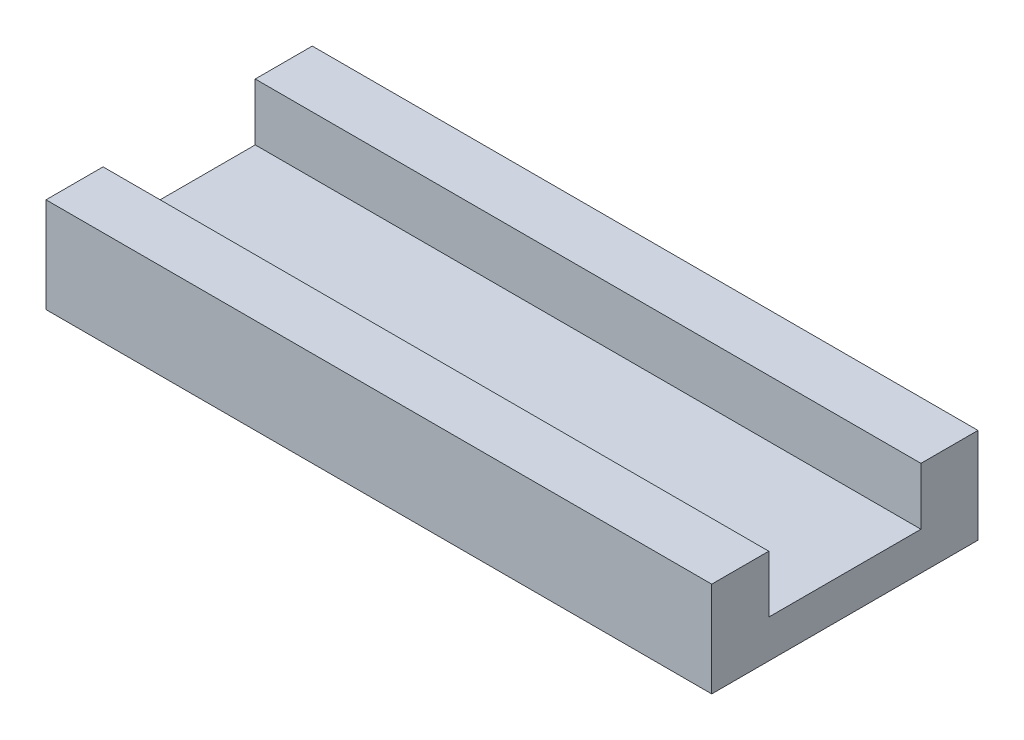
ISO-10303-21;
HEADER;
FILE_DESCRIPTION(('STEP AP214'),'2;1');
FILE_NAME('part.step','',(''),(''),'','','');
FILE_SCHEMA(('AUTOMOTIVE_DESIGN { 1 0 10303 214 1 1 1 1 }'));
ENDSEC;
DATA;
#1=APPLICATION_CONTEXT('core data for automotive mechanical design processes');
#2=APPLICATION_PROTOCOL_DEFINITION('international standard','automotive_design',2000,#1);
#3=PRODUCT_CONTEXT('',#1,'mechanical');
#4=PRODUCT('Part','Part','',(#3));
#5=PRODUCT_RELATED_PRODUCT_CATEGORY('part','',(#4));
#6=PRODUCT_DEFINITION_FORMATION('','',#4);
#7=PRODUCT_DEFINITION_CONTEXT('part definition',#1,'design');
#8=PRODUCT_DEFINITION('design','',#6,#7);
#9=PRODUCT_DEFINITION_SHAPE('','',#8);
#10=(LENGTH_UNIT() NAMED_UNIT(*) SI_UNIT(.MILLI.,.METRE.));
#11=(NAMED_UNIT(*) PLANE_ANGLE_UNIT() SI_UNIT($,.RADIAN.));
#12=(NAMED_UNIT(*) SI_UNIT($,.STERADIAN.) SOLID_ANGLE_UNIT());
#13=UNCERTAINTY_MEASURE_WITH_UNIT(LENGTH_MEASURE(1.E-05),#10,'distance_accuracy_value','');
#14=(GEOMETRIC_REPRESENTATION_CONTEXT(3) GLOBAL_UNCERTAINTY_ASSIGNED_CONTEXT((#13)) GLOBAL_UNIT_ASSIGNED_CONTEXT((#10,
#11,#12)) REPRESENTATION_CONTEXT('',''));
#15=CARTESIAN_POINT('',(0.,0.,0.));
#16=DIRECTION('',(0.,0.,1.));
#17=DIRECTION('',(1.,0.,0.));
#18=AXIS2_PLACEMENT_3D('',#15,#16,#17);
#19=CARTESIAN_POINT('',(-35.,-1.,-7.));
#20=DIRECTION('',(0.,0.,-1.));
#21=DIRECTION('',(-1.,0.,0.));
#22=AXIS2_PLACEMENT_3D('',#19,#20,#21);
#23=PLANE('',#22);
#24=DIRECTION('',(0.,1.,0.));
#25=VECTOR('',#24,1.);
#26=CARTESIAN_POINT('',(0.,-1.,-7.));
#27=LINE('',#26,#25);
#28=CARTESIAN_POINT('',(0.,-1.,-7.));
#29=VERTEX_POINT('',#28);
#30=CARTESIAN_POINT('',(0.,4.,-7.));
#31=VERTEX_POINT('',#30);
#32=EDGE_CURVE('E153',#29,#31,#27,.T.);
#33=ORIENTED_EDGE('',*,*,#32,.F.);
#34=DIRECTION('',(1.,0.,0.));
#35=VECTOR('',#34,1.);
#36=CARTESIAN_POINT('',(-35.,-1.,-7.));
#37=LINE('',#36,#35);
#38=CARTESIAN_POINT('',(-35.,-1.,-7.));
#39=VERTEX_POINT('',#38);
#40=EDGE_CURVE('E11',#39,#29,#37,.T.);
#41=ORIENTED_EDGE('',*,*,#40,.F.);
#42=DIRECTION('',(0.,1.,0.));
#43=VECTOR('',#42,1.);
#44=CARTESIAN_POINT('',(-35.,1.,-7.));
#45=LINE('',#44,#43);
#46=CARTESIAN_POINT('',(-35.,4.,-7.));
#47=VERTEX_POINT('',#46);
#48=EDGE_CURVE('E56',#39,#47,#45,.T.);
#49=ORIENTED_EDGE('',*,*,#48,.T.);
#50=DIRECTION('',(1.,0.,0.));
#51=VECTOR('',#50,1.);
#52=CARTESIAN_POINT('',(-35.,4.,-7.));
#53=LINE('',#52,#51);
#54=EDGE_CURVE('E41',#47,#31,#53,.T.);
#55=ORIENTED_EDGE('',*,*,#54,.T.);
#56=EDGE_LOOP('',(#33,#41,#49,#55));
#57=FACE_BOUND('',#56,.T.);
#58=ADVANCED_FACE('F37',(#57),#23,.T.);
#59=CARTESIAN_POINT('',(-35.,-1.,7.));
#60=DIRECTION('',(0.,-1.,0.));
#61=DIRECTION('',(0.,0.,-1.));
#62=AXIS2_PLACEMENT_3D('',#59,#60,#61);
#63=PLANE('',#62);
#64=DIRECTION('',(0.,0.,-1.));
#65=VECTOR('',#64,1.);
#66=CARTESIAN_POINT('',(0.,-1.,7.));
#67=LINE('',#66,#65);
#68=CARTESIAN_POINT('',(0.,-1.,7.));
#69=VERTEX_POINT('',#68);
#70=EDGE_CURVE('E151',#69,#29,#67,.T.);
#71=ORIENTED_EDGE('',*,*,#70,.F.);
#72=DIRECTION('',(1.,0.,0.));
#73=VECTOR('',#72,1.);
#74=CARTESIAN_POINT('',(-35.,-1.,7.));
#75=LINE('',#74,#73);
#76=CARTESIAN_POINT('',(-35.,-1.,7.));
#77=VERTEX_POINT('',#76);
#78=EDGE_CURVE('E47',#77,#69,#75,.T.);
#79=ORIENTED_EDGE('',*,*,#78,.F.);
#80=DIRECTION('',(0.,0.,-1.));
#81=VECTOR('',#80,1.);
#82=CARTESIAN_POINT('',(-35.,-1.,7.));
#83=LINE('',#82,#81);
#84=EDGE_CURVE('E126',#77,#39,#83,.T.);
#85=ORIENTED_EDGE('',*,*,#84,.T.);
#86=ORIENTED_EDGE('',*,*,#40,.T.);
#87=EDGE_LOOP('',(#71,#79,#85,#86));
#88=FACE_BOUND('',#87,.T.);
#89=ADVANCED_FACE('F166',(#88),#63,.T.);
#90=CARTESIAN_POINT('',(-35.,-1.,7.));
#91=DIRECTION('',(0.,0.,1.));
#92=DIRECTION('',(1.,0.,0.));
#93=AXIS2_PLACEMENT_3D('',#90,#91,#92);
#94=PLANE('',#93);
#95=DIRECTION('',(0.,-1.,0.));
#96=VECTOR('',#95,1.);
#97=CARTESIAN_POINT('',(0.,-1.,7.));
#98=LINE('',#97,#96);
#99=CARTESIAN_POINT('',(0.,4.,7.));
#100=VERTEX_POINT('',#99);
#101=EDGE_CURVE('E114',#100,#69,#98,.T.);
#102=ORIENTED_EDGE('',*,*,#101,.F.);
#103=DIRECTION('',(1.,0.,0.));
#104=VECTOR('',#103,1.);
#105=CARTESIAN_POINT('',(-35.,4.,7.));
#106=LINE('',#105,#104);
#107=CARTESIAN_POINT('',(-35.,4.,7.));
#108=VERTEX_POINT('',#107);
#109=EDGE_CURVE('E109',#108,#100,#106,.T.);
#110=ORIENTED_EDGE('',*,*,#109,.F.);
#111=DIRECTION('',(0.,-1.,0.));
#112=VECTOR('',#111,1.);
#113=CARTESIAN_POINT('',(-35.,1.,7.));
#114=LINE('',#113,#112);
#115=EDGE_CURVE('E112',#108,#77,#114,.T.);
#116=ORIENTED_EDGE('',*,*,#115,.T.);
#117=ORIENTED_EDGE('',*,*,#78,.T.);
#118=EDGE_LOOP('',(#102,#110,#116,#117));
#119=FACE_BOUND('',#118,.T.);
#120=ADVANCED_FACE('F111',(#119),#94,.T.);
#121=CARTESIAN_POINT('',(-35.,4.,7.));
#122=DIRECTION('',(0.,1.,0.));
#123=DIRECTION('',(0.,0.,1.));
#124=AXIS2_PLACEMENT_3D('',#121,#122,#123);
#125=PLANE('',#124);
#126=DIRECTION('',(0.,0.,1.));
#127=VECTOR('',#126,1.);
#128=CARTESIAN_POINT('',(0.,4.,7.));
#129=LINE('',#128,#127);
#130=CARTESIAN_POINT('',(0.,4.,4.));
#131=VERTEX_POINT('',#130);
#132=EDGE_CURVE('E148',#131,#100,#129,.T.);
#133=ORIENTED_EDGE('',*,*,#132,.F.);
#134=DIRECTION('',(1.,0.,0.));
#135=VECTOR('',#134,1.);
#136=CARTESIAN_POINT('',(-35.,4.,4.));
#137=LINE('',#136,#135);
#138=CARTESIAN_POINT('',(-35.,4.,4.));
#139=VERTEX_POINT('',#138);
#140=EDGE_CURVE('E119',#139,#131,#137,.T.);
#141=ORIENTED_EDGE('',*,*,#140,.F.);
#142=DIRECTION('',(0.,0.,1.));
#143=VECTOR('',#142,1.);
#144=CARTESIAN_POINT('',(-35.,4.,7.));
#145=LINE('',#144,#143);
#146=EDGE_CURVE('E124',#139,#108,#145,.T.);
#147=ORIENTED_EDGE('',*,*,#146,.T.);
#148=ORIENTED_EDGE('',*,*,#109,.T.);
#149=EDGE_LOOP('',(#133,#141,#147,#148));
#150=FACE_BOUND('',#149,.T.);
#151=ADVANCED_FACE('F128',(#150),#125,.T.);
#152=CARTESIAN_POINT('',(-35.,4.,4.));
#153=DIRECTION('',(0.,0.,-1.));
#154=DIRECTION('',(-1.,0.,0.));
#155=AXIS2_PLACEMENT_3D('',#152,#153,#154);
#156=PLANE('',#155);
#157=DIRECTION('',(0.,1.,0.));
#158=VECTOR('',#157,1.);
#159=CARTESIAN_POINT('',(0.,4.,4.));
#160=LINE('',#159,#158);
#161=CARTESIAN_POINT('',(0.,1.,4.));
#162=VERTEX_POINT('',#161);
#163=EDGE_CURVE('E145',#162,#131,#160,.T.);
#164=ORIENTED_EDGE('',*,*,#163,.F.);
#165=DIRECTION('',(1.,0.,0.));
#166=VECTOR('',#165,1.);
#167=CARTESIAN_POINT('',(-35.,1.,4.));
#168=LINE('',#167,#166);
#169=CARTESIAN_POINT('',(-35.,1.,4.));
#170=VERTEX_POINT('',#169);
#171=EDGE_CURVE('E157',#170,#162,#168,.T.);
#172=ORIENTED_EDGE('',*,*,#171,.F.);
#173=DIRECTION('',(0.,1.,0.));
#174=VECTOR('',#173,1.);
#175=CARTESIAN_POINT('',(-35.,4.,4.));
#176=LINE('',#175,#174);
#177=EDGE_CURVE('E129',#170,#139,#176,.T.);
#178=ORIENTED_EDGE('',*,*,#177,.T.);
#179=ORIENTED_EDGE('',*,*,#140,.T.);
#180=EDGE_LOOP('',(#164,#172,#178,#179));
#181=FACE_BOUND('',#180,.T.);
#182=ADVANCED_FACE('F179',(#181),#156,.T.);
#183=CARTESIAN_POINT('',(-35.,1.,4.));
#184=DIRECTION('',(0.,1.,0.));
#185=DIRECTION('',(0.,0.,1.));
#186=AXIS2_PLACEMENT_3D('',#183,#184,#185);
#187=PLANE('',#186);
#188=DIRECTION('',(0.,0.,1.));
#189=VECTOR('',#188,1.);
#190=CARTESIAN_POINT('',(0.,1.,4.));
#191=LINE('',#190,#189);
#192=CARTESIAN_POINT('',(0.,1.,-4.));
#193=VERTEX_POINT('',#192);
#194=EDGE_CURVE('E142',#193,#162,#191,.T.);
#195=ORIENTED_EDGE('',*,*,#194,.F.);
#196=DIRECTION('',(1.,0.,0.));
#197=VECTOR('',#196,1.);
#198=CARTESIAN_POINT('',(-35.,1.,-4.));
#199=LINE('',#198,#197);
#200=CARTESIAN_POINT('',(-35.,1.,-4.));
#201=VERTEX_POINT('',#200);
#202=EDGE_CURVE('E159',#201,#193,#199,.T.);
#203=ORIENTED_EDGE('',*,*,#202,.F.);
#204=DIRECTION('',(0.,0.,1.));
#205=VECTOR('',#204,1.);
#206=CARTESIAN_POINT('',(-35.,1.,4.));
#207=LINE('',#206,#205);
#208=EDGE_CURVE('E131',#201,#170,#207,.T.);
#209=ORIENTED_EDGE('',*,*,#208,.T.);
#210=ORIENTED_EDGE('',*,*,#171,.T.);
#211=EDGE_LOOP('',(#195,#203,#209,#210));
#212=FACE_BOUND('',#211,.T.);
#213=ADVANCED_FACE('F182',(#212),#187,.T.);
#214=CARTESIAN_POINT('',(-35.,4.,-4.));
#215=DIRECTION('',(0.,0.,1.));
#216=DIRECTION('',(1.,0.,0.));
#217=AXIS2_PLACEMENT_3D('',#214,#215,#216);
#218=PLANE('',#217);
#219=DIRECTION('',(0.,-1.,0.));
#220=VECTOR('',#219,1.);
#221=CARTESIAN_POINT('',(0.,4.,-4.));
#222=LINE('',#221,#220);
#223=CARTESIAN_POINT('',(0.,4.,-4.));
#224=VERTEX_POINT('',#223);
#225=EDGE_CURVE('E139',#224,#193,#222,.T.);
#226=ORIENTED_EDGE('',*,*,#225,.F.);
#227=DIRECTION('',(1.,0.,0.));
#228=VECTOR('',#227,1.);
#229=CARTESIAN_POINT('',(-35.,4.,-4.));
#230=LINE('',#229,#228);
#231=CARTESIAN_POINT('',(-35.,4.,-4.));
#232=VERTEX_POINT('',#231);
#233=EDGE_CURVE('E160',#232,#224,#230,.T.);
#234=ORIENTED_EDGE('',*,*,#233,.F.);
#235=DIRECTION('',(0.,-1.,0.));
#236=VECTOR('',#235,1.);
#237=CARTESIAN_POINT('',(-35.,4.,-4.));
#238=LINE('',#237,#236);
#239=EDGE_CURVE('E195',#232,#201,#238,.T.);
#240=ORIENTED_EDGE('',*,*,#239,.T.);
#241=ORIENTED_EDGE('',*,*,#202,.T.);
#242=EDGE_LOOP('',(#226,#234,#240,#241));
#243=FACE_BOUND('',#242,.T.);
#244=ADVANCED_FACE('F185',(#243),#218,.T.);
#245=CARTESIAN_POINT('',(-35.,4.,-7.));
#246=DIRECTION('',(0.,1.,0.));
#247=DIRECTION('',(0.,0.,1.));
#248=AXIS2_PLACEMENT_3D('',#245,#246,#247);
#249=PLANE('',#248);
#250=DIRECTION('',(0.,0.,1.));
#251=VECTOR('',#250,1.);
#252=CARTESIAN_POINT('',(0.,4.,-7.));
#253=LINE('',#252,#251);
#254=EDGE_CURVE('E136',#31,#224,#253,.T.);
#255=ORIENTED_EDGE('',*,*,#254,.F.);
#256=ORIENTED_EDGE('',*,*,#54,.F.);
#257=DIRECTION('',(0.,0.,1.));
#258=VECTOR('',#257,1.);
#259=CARTESIAN_POINT('',(-35.,4.,-7.));
#260=LINE('',#259,#258);
#261=EDGE_CURVE('E199',#47,#232,#260,.T.);
#262=ORIENTED_EDGE('',*,*,#261,.T.);
#263=ORIENTED_EDGE('',*,*,#233,.T.);
#264=EDGE_LOOP('',(#255,#256,#262,#263));
#265=FACE_BOUND('',#264,.T.);
#266=ADVANCED_FACE('F39',(#265),#249,.T.);
#267=CARTESIAN_POINT('',(-35.,0.,0.));
#268=DIRECTION('',(1.,0.,0.));
#269=DIRECTION('',(0.,0.,-1.));
#270=AXIS2_PLACEMENT_3D('',#267,#268,#269);
#271=PLANE('',#270);
#272=ORIENTED_EDGE('',*,*,#48,.F.);
#273=ORIENTED_EDGE('',*,*,#84,.F.);
#274=ORIENTED_EDGE('',*,*,#115,.F.);
#275=ORIENTED_EDGE('',*,*,#146,.F.);
#276=ORIENTED_EDGE('',*,*,#177,.F.);
#277=ORIENTED_EDGE('',*,*,#208,.F.);
#278=ORIENTED_EDGE('',*,*,#239,.F.);
#279=ORIENTED_EDGE('',*,*,#261,.F.);
#280=EDGE_LOOP('',(#272,#273,#274,#275,#276,#277,#278,#279));
#281=FACE_BOUND('',#280,.T.);
#282=ADVANCED_FACE('F122',(#281),#271,.F.);
#283=CARTESIAN_POINT('',(0.,0.,0.));
#284=DIRECTION('',(1.,0.,0.));
#285=DIRECTION('',(0.,0.,-1.));
#286=AXIS2_PLACEMENT_3D('',#283,#284,#285);
#287=PLANE('',#286);
#288=ORIENTED_EDGE('',*,*,#32,.T.);
#289=ORIENTED_EDGE('',*,*,#254,.T.);
#290=ORIENTED_EDGE('',*,*,#225,.T.);
#291=ORIENTED_EDGE('',*,*,#194,.T.);
#292=ORIENTED_EDGE('',*,*,#163,.T.);
#293=ORIENTED_EDGE('',*,*,#132,.T.);
#294=ORIENTED_EDGE('',*,*,#101,.T.);
#295=ORIENTED_EDGE('',*,*,#70,.T.);
#296=EDGE_LOOP('',(#288,#289,#290,#291,#292,#293,#294,#295));
#297=FACE_BOUND('',#296,.T.);
#298=ADVANCED_FACE('F165',(#297),#287,.T.);
#299=CLOSED_SHELL('',(#58,#89,#120,#151,#182,#213,#244,#266,#282,#298));
#300=MANIFOLD_SOLID_BREP('B2',#299);
#301=ADVANCED_BREP_SHAPE_REPRESENTATION('',(#18,#300),#14);
#302=SHAPE_DEFINITION_REPRESENTATION(#9,#301);
ENDSEC;
END-ISO-10303-21;
